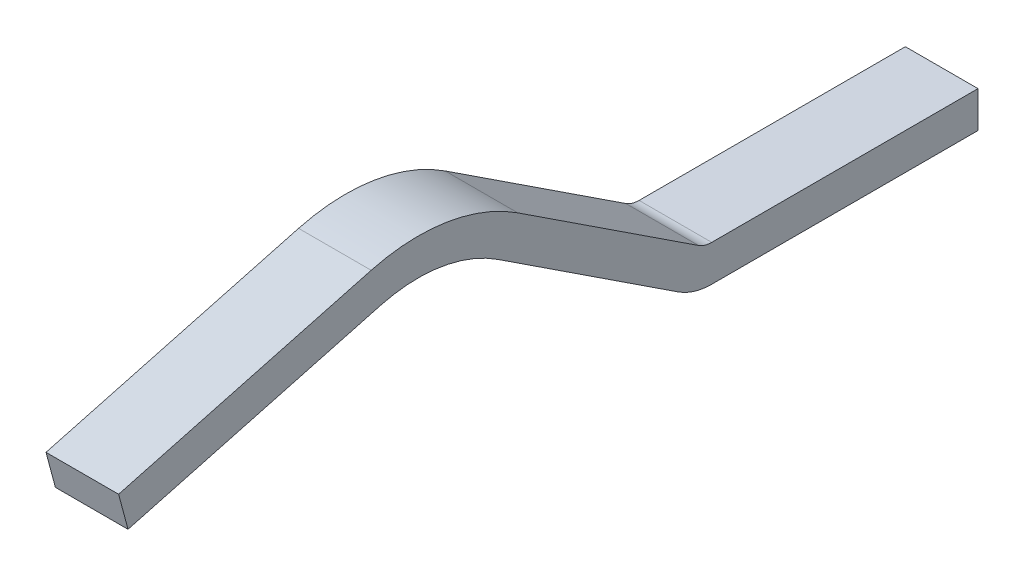
ISO-10303-21;
HEADER;
FILE_DESCRIPTION(('STEP AP214'),'2;1');
FILE_NAME('part.step','',(''),(''),'','','');
FILE_SCHEMA(('AUTOMOTIVE_DESIGN { 1 0 10303 214 1 1 1 1 }'));
ENDSEC;
DATA;
#1=APPLICATION_CONTEXT('core data for automotive mechanical design processes');
#2=APPLICATION_PROTOCOL_DEFINITION('international standard','automotive_design',2000,#1);
#3=PRODUCT_CONTEXT('',#1,'mechanical');
#4=PRODUCT('Part','Part','',(#3));
#5=PRODUCT_RELATED_PRODUCT_CATEGORY('part','',(#4));
#6=PRODUCT_DEFINITION_FORMATION('','',#4);
#7=PRODUCT_DEFINITION_CONTEXT('part definition',#1,'design');
#8=PRODUCT_DEFINITION('design','',#6,#7);
#9=PRODUCT_DEFINITION_SHAPE('','',#8);
#10=(LENGTH_UNIT() NAMED_UNIT(*) SI_UNIT(.MILLI.,.METRE.));
#11=(NAMED_UNIT(*) PLANE_ANGLE_UNIT() SI_UNIT($,.RADIAN.));
#12=(NAMED_UNIT(*) SI_UNIT($,.STERADIAN.) SOLID_ANGLE_UNIT());
#13=UNCERTAINTY_MEASURE_WITH_UNIT(LENGTH_MEASURE(1.E-05),#10,'distance_accuracy_value','');
#14=(GEOMETRIC_REPRESENTATION_CONTEXT(3) GLOBAL_UNCERTAINTY_ASSIGNED_CONTEXT((#13)) GLOBAL_UNIT_ASSIGNED_CONTEXT((#10,
#11,#12)) REPRESENTATION_CONTEXT('',''));
#15=CARTESIAN_POINT('',(0.,0.,0.));
#16=DIRECTION('',(0.,0.,1.));
#17=DIRECTION('',(1.,0.,0.));
#18=AXIS2_PLACEMENT_3D('',#15,#16,#17);
#19=CARTESIAN_POINT('',(-4.55000000000001,5.07100850144757,-1.18999999999999));
#20=DIRECTION('',(-1.,0.,0.));
#21=DIRECTION('',(0.,0.,1.));
#22=AXIS2_PLACEMENT_3D('',#19,#20,#21);
#23=PLANE('',#22);
#24=CARTESIAN_POINT('',(-4.55000000000001,5.07100850144757,-1.18999999999999));
#25=DIRECTION('',(1.,0.,0.));
#26=DIRECTION('',(0.,0.,-1.));
#27=AXIS2_PLACEMENT_3D('',#24,#25,#26);
#28=CIRCLE('',#27,0.1);
#29=CARTESIAN_POINT('',(-4.55000000000001,4.98740012933444,-1.13513981304631));
#30=VERTEX_POINT('',#29);
#31=CARTESIAN_POINT('',(-4.55000000000001,4.97100850144757,-1.18999999999999));
#32=VERTEX_POINT('',#31);
#33=EDGE_CURVE('E11',#30,#32,#28,.T.);
#34=ORIENTED_EDGE('',*,*,#33,.T.);
#35=DIRECTION('',(0.,0.,-1.));
#36=VECTOR('',#35,1.);
#37=CARTESIAN_POINT('',(-4.55000000000001,4.97100850144757,-1.18999999999999));
#38=LINE('',#37,#36);
#39=CARTESIAN_POINT('',(-4.55000000000001,4.97100850144757,-2.28999999999999));
#40=VERTEX_POINT('',#39);
#41=EDGE_CURVE('E24',#32,#40,#38,.T.);
#42=ORIENTED_EDGE('',*,*,#41,.T.);
#43=DIRECTION('',(0.,-1.,0.));
#44=VECTOR('',#43,1.);
#45=CARTESIAN_POINT('',(-4.55000000000001,5.07100850144757,-2.28999999999999));
#46=LINE('',#45,#44);
#47=CARTESIAN_POINT('',(-4.55000000000001,4.82100850144757,-2.28999999999999));
#48=VERTEX_POINT('',#47);
#49=EDGE_CURVE('E197',#40,#48,#46,.T.);
#50=ORIENTED_EDGE('',*,*,#49,.T.);
#51=DIRECTION('',(0.,0.,1.));
#52=VECTOR('',#51,1.);
#53=CARTESIAN_POINT('',(-4.55000000000001,4.82100850144757,-1.18999999999999));
#54=LINE('',#53,#52);
#55=CARTESIAN_POINT('',(-4.55000000000001,4.82100850144757,-1.18999999999999));
#56=VERTEX_POINT('',#55);
#57=EDGE_CURVE('E107',#48,#56,#54,.T.);
#58=ORIENTED_EDGE('',*,*,#57,.T.);
#59=CARTESIAN_POINT('',(-4.55000000000001,5.07100850144757,-1.18999999999999));
#60=DIRECTION('',(-1.,0.,0.));
#61=DIRECTION('',(0.,0.,-1.));
#62=AXIS2_PLACEMENT_3D('',#59,#60,#61);
#63=CIRCLE('',#62,0.25);
#64=CARTESIAN_POINT('',(-4.55000000000001,4.86198757116474,-1.0528495326158));
#65=VERTEX_POINT('',#64);
#66=EDGE_CURVE('E194',#56,#65,#63,.T.);
#67=ORIENTED_EDGE('',*,*,#66,.T.);
#68=DIRECTION('',(0.,0.548601869536769,0.836083721131301));
#69=VECTOR('',#68,1.);
#70=CARTESIAN_POINT('',(-4.55000000000001,4.86198757116474,-1.0528495326158));
#71=LINE('',#70,#69);
#72=CARTESIAN_POINT('',(-4.55000000000001,5.35165023267873,-0.306590719310327));
#73=VERTEX_POINT('',#72);
#74=EDGE_CURVE('E192',#65,#73,#71,.T.);
#75=ORIENTED_EDGE('',*,*,#74,.T.);
#76=CARTESIAN_POINT('',(-4.55000000000001,4.84999999999995,0.0225704024117354));
#77=DIRECTION('',(1.,0.,0.));
#78=DIRECTION('',(0.,0.,-1.));
#79=AXIS2_PLACEMENT_3D('',#76,#77,#78);
#80=CIRCLE('',#79,0.6);
#81=CARTESIAN_POINT('',(-4.55000000000001,5.42955549577339,0.177861829473247));
#82=VERTEX_POINT('',#81);
#83=EDGE_CURVE('E190',#73,#82,#80,.T.);
#84=ORIENTED_EDGE('',*,*,#83,.T.);
#85=DIRECTION('',(0.,-0.258819045102521,0.965925826289068));
#86=VECTOR('',#85,1.);
#87=CARTESIAN_POINT('',(-4.55000000000001,5.42955549577339,0.177861829473248));
#88=LINE('',#87,#86);
#89=CARTESIAN_POINT('',(-4.55000000000001,5.15,1.22117714323463));
#90=VERTEX_POINT('',#89);
#91=EDGE_CURVE('E188',#82,#90,#88,.T.);
#92=ORIENTED_EDGE('',*,*,#91,.T.);
#93=DIRECTION('',(0.,0.965925826289067,0.258819045102525));
#94=VECTOR('',#93,1.);
#95=CARTESIAN_POINT('',(-4.55000000000001,5.15,1.22117714323463));
#96=LINE('',#95,#94);
#97=CARTESIAN_POINT('',(-4.55000000000001,5.29488887394337,1.26000000000001));
#98=VERTEX_POINT('',#97);
#99=EDGE_CURVE('E186',#90,#98,#96,.T.);
#100=ORIENTED_EDGE('',*,*,#99,.T.);
#101=DIRECTION('',(0.,0.258819045102521,-0.965925826289068));
#102=VECTOR('',#101,1.);
#103=CARTESIAN_POINT('',(-4.55000000000001,5.29488887394337,1.26000000000001));
#104=LINE('',#103,#102);
#105=CARTESIAN_POINT('',(-4.55000000000001,5.57444436971675,0.216684686238627));
#106=VERTEX_POINT('',#105);
#107=EDGE_CURVE('E184',#98,#106,#104,.T.);
#108=ORIENTED_EDGE('',*,*,#107,.T.);
#109=CARTESIAN_POINT('',(-4.55000000000001,4.84999999999995,0.0225704024117354));
#110=DIRECTION('',(-1.,0.,0.));
#111=DIRECTION('',(0.,0.,-1.));
#112=AXIS2_PLACEMENT_3D('',#109,#110,#111);
#113=CIRCLE('',#112,0.75);
#114=CARTESIAN_POINT('',(-4.55000000000001,5.47706279084843,-0.388880999740842));
#115=VERTEX_POINT('',#114);
#116=EDGE_CURVE('E182',#106,#115,#113,.T.);
#117=ORIENTED_EDGE('',*,*,#116,.T.);
#118=DIRECTION('',(0.,-0.548601869536769,-0.8360837211313));
#119=VECTOR('',#118,1.);
#120=CARTESIAN_POINT('',(-4.55000000000001,5.47706279084843,-0.388880999740842));
#121=LINE('',#120,#119);
#122=EDGE_CURVE('E180',#115,#30,#121,.T.);
#123=ORIENTED_EDGE('',*,*,#122,.T.);
#124=EDGE_LOOP('',(#34,#42,#50,#58,#67,#75,#84,#92,#100,#108,#117,#123));
#125=FACE_BOUND('',#124,.T.);
#126=ADVANCED_FACE('F17',(#125),#23,.T.);
#127=CARTESIAN_POINT('',(-4.55000000000001,4.97100850144757,-1.18999999999999));
#128=DIRECTION('',(0.,-1.,0.));
#129=DIRECTION('',(0.,0.,-1.));
#130=AXIS2_PLACEMENT_3D('',#127,#128,#129);
#131=PLANE('',#130);
#132=DIRECTION('',(1.,0.,0.));
#133=VECTOR('',#132,1.);
#134=CARTESIAN_POINT('',(-4.55000000000001,4.97100850144757,-2.28999999999999));
#135=LINE('',#134,#133);
#136=CARTESIAN_POINT('',(-4.25000000000001,4.97100850144757,-2.28999999999999));
#137=VERTEX_POINT('',#136);
#138=EDGE_CURVE('E124',#40,#137,#135,.T.);
#139=ORIENTED_EDGE('',*,*,#138,.F.);
#140=ORIENTED_EDGE('',*,*,#41,.F.);
#141=DIRECTION('',(-1.,0.,0.));
#142=VECTOR('',#141,1.);
#143=CARTESIAN_POINT('',(-4.55000000000001,4.97100850144757,-1.18999999999999));
#144=LINE('',#143,#142);
#145=CARTESIAN_POINT('',(-4.25000000000001,4.97100850144757,-1.18999999999999));
#146=VERTEX_POINT('',#145);
#147=EDGE_CURVE('E177',#146,#32,#144,.T.);
#148=ORIENTED_EDGE('',*,*,#147,.F.);
#149=DIRECTION('',(0.,0.,1.));
#150=VECTOR('',#149,1.);
#151=CARTESIAN_POINT('',(-4.25000000000001,4.97100850144757,-1.18999999999999));
#152=LINE('',#151,#150);
#153=EDGE_CURVE('E175',#137,#146,#152,.T.);
#154=ORIENTED_EDGE('',*,*,#153,.F.);
#155=EDGE_LOOP('',(#139,#140,#148,#154));
#156=FACE_BOUND('',#155,.T.);
#157=ADVANCED_FACE('F199',(#156),#131,.F.);
#158=CARTESIAN_POINT('',(-4.55000000000001,5.47706279084843,-0.388880999740842));
#159=DIRECTION('',(0.,-0.8360837211313,0.548601869536769));
#160=DIRECTION('',(0.,-0.548601869536769,-0.8360837211313));
#161=AXIS2_PLACEMENT_3D('',#158,#159,#160);
#162=PLANE('',#161);
#163=DIRECTION('',(1.,0.,0.));
#164=VECTOR('',#163,1.);
#165=CARTESIAN_POINT('',(-4.55000000000001,4.98740012933444,-1.13513981304631));
#166=LINE('',#165,#164);
#167=CARTESIAN_POINT('',(-4.25000000000001,4.98740012933444,-1.13513981304631));
#168=VERTEX_POINT('',#167);
#169=EDGE_CURVE('E173',#30,#168,#166,.T.);
#170=ORIENTED_EDGE('',*,*,#169,.F.);
#171=ORIENTED_EDGE('',*,*,#122,.F.);
#172=DIRECTION('',(-1.,0.,0.));
#173=VECTOR('',#172,1.);
#174=CARTESIAN_POINT('',(-4.55000000000001,5.47706279084843,-0.388880999740842));
#175=LINE('',#174,#173);
#176=CARTESIAN_POINT('',(-4.25000000000001,5.47706279084843,-0.388880999740842));
#177=VERTEX_POINT('',#176);
#178=EDGE_CURVE('E170',#177,#115,#175,.T.);
#179=ORIENTED_EDGE('',*,*,#178,.F.);
#180=DIRECTION('',(0.,0.548601869536769,0.8360837211313));
#181=VECTOR('',#180,1.);
#182=CARTESIAN_POINT('',(-4.25000000000001,5.47706279084843,-0.388880999740842));
#183=LINE('',#182,#181);
#184=EDGE_CURVE('E167',#168,#177,#183,.T.);
#185=ORIENTED_EDGE('',*,*,#184,.F.);
#186=EDGE_LOOP('',(#170,#171,#179,#185));
#187=FACE_BOUND('',#186,.T.);
#188=ADVANCED_FACE('F206',(#187),#162,.F.);
#189=CARTESIAN_POINT('',(-4.55000000000001,4.84999999999995,0.0225704024117354));
#190=DIRECTION('',(1.,0.,0.));
#191=DIRECTION('',(0.,0.,-1.));
#192=AXIS2_PLACEMENT_3D('',#189,#190,#191);
#193=CYLINDRICAL_SURFACE('',#192,0.75);
#194=ORIENTED_EDGE('',*,*,#116,.F.);
#195=DIRECTION('',(1.,0.,0.));
#196=VECTOR('',#195,1.);
#197=CARTESIAN_POINT('',(-4.55000000000001,5.57444436971675,0.216684686238627));
#198=LINE('',#197,#196);
#199=CARTESIAN_POINT('',(-4.25000000000001,5.57444436971675,0.216684686238627));
#200=VERTEX_POINT('',#199);
#201=EDGE_CURVE('E165',#106,#200,#198,.T.);
#202=ORIENTED_EDGE('',*,*,#201,.T.);
#203=CARTESIAN_POINT('',(-4.25000000000001,4.84999999999995,0.0225704024117354));
#204=DIRECTION('',(-1.,0.,0.));
#205=DIRECTION('',(0.,0.,-1.));
#206=AXIS2_PLACEMENT_3D('',#203,#204,#205);
#207=CIRCLE('',#206,0.75);
#208=EDGE_CURVE('E162',#200,#177,#207,.T.);
#209=ORIENTED_EDGE('',*,*,#208,.T.);
#210=ORIENTED_EDGE('',*,*,#178,.T.);
#211=EDGE_LOOP('',(#194,#202,#209,#210));
#212=FACE_BOUND('',#211,.T.);
#213=ADVANCED_FACE('F211',(#212),#193,.T.);
#214=CARTESIAN_POINT('',(-4.55000000000001,5.29488887394337,1.26000000000001));
#215=DIRECTION('',(0.,-0.965925826289068,-0.258819045102522));
#216=DIRECTION('',(0.,0.258819045102522,-0.965925826289068));
#217=AXIS2_PLACEMENT_3D('',#214,#215,#216);
#218=PLANE('',#217);
#219=ORIENTED_EDGE('',*,*,#201,.F.);
#220=ORIENTED_EDGE('',*,*,#107,.F.);
#221=DIRECTION('',(-1.,0.,0.));
#222=VECTOR('',#221,1.);
#223=CARTESIAN_POINT('',(-4.55000000000001,5.29488887394337,1.26000000000001));
#224=LINE('',#223,#222);
#225=CARTESIAN_POINT('',(-4.25000000000001,5.29488887394337,1.26000000000001));
#226=VERTEX_POINT('',#225);
#227=EDGE_CURVE('E159',#226,#98,#224,.T.);
#228=ORIENTED_EDGE('',*,*,#227,.F.);
#229=DIRECTION('',(0.,-0.258819045102522,0.965925826289068));
#230=VECTOR('',#229,1.);
#231=CARTESIAN_POINT('',(-4.25000000000001,5.29488887394337,1.26000000000001));
#232=LINE('',#231,#230);
#233=EDGE_CURVE('E156',#200,#226,#232,.T.);
#234=ORIENTED_EDGE('',*,*,#233,.F.);
#235=EDGE_LOOP('',(#219,#220,#228,#234));
#236=FACE_BOUND('',#235,.T.);
#237=ADVANCED_FACE('F215',(#236),#218,.F.);
#238=CARTESIAN_POINT('',(-4.55000000000001,5.15,1.22117714323463));
#239=DIRECTION('',(0.,0.258819045102524,-0.965925826289067));
#240=DIRECTION('',(0.,0.965925826289067,0.258819045102524));
#241=AXIS2_PLACEMENT_3D('',#238,#239,#240);
#242=PLANE('',#241);
#243=ORIENTED_EDGE('',*,*,#227,.T.);
#244=ORIENTED_EDGE('',*,*,#99,.F.);
#245=DIRECTION('',(-1.,0.,0.));
#246=VECTOR('',#245,1.);
#247=CARTESIAN_POINT('',(-4.55000000000001,5.15,1.22117714323463));
#248=LINE('',#247,#246);
#249=CARTESIAN_POINT('',(-4.25000000000001,5.15,1.22117714323463));
#250=VERTEX_POINT('',#249);
#251=EDGE_CURVE('E153',#250,#90,#248,.T.);
#252=ORIENTED_EDGE('',*,*,#251,.F.);
#253=DIRECTION('',(0.,-0.965925826289067,-0.258819045102524));
#254=VECTOR('',#253,1.);
#255=CARTESIAN_POINT('',(-4.25000000000001,5.15,1.22117714323463));
#256=LINE('',#255,#254);
#257=EDGE_CURVE('E150',#226,#250,#256,.T.);
#258=ORIENTED_EDGE('',*,*,#257,.F.);
#259=EDGE_LOOP('',(#243,#244,#252,#258));
#260=FACE_BOUND('',#259,.T.);
#261=ADVANCED_FACE('F219',(#260),#242,.F.);
#262=CARTESIAN_POINT('',(-4.55000000000001,5.42955549577339,0.177861829473248));
#263=DIRECTION('',(0.,0.965925826289068,0.258819045102521));
#264=DIRECTION('',(0.,-0.258819045102521,0.965925826289068));
#265=AXIS2_PLACEMENT_3D('',#262,#263,#264);
#266=PLANE('',#265);
#267=ORIENTED_EDGE('',*,*,#251,.T.);
#268=ORIENTED_EDGE('',*,*,#91,.F.);
#269=DIRECTION('',(-1.,0.,0.));
#270=VECTOR('',#269,1.);
#271=CARTESIAN_POINT('',(-4.55000000000001,5.42955549577339,0.177861829473248));
#272=LINE('',#271,#270);
#273=CARTESIAN_POINT('',(-4.25000000000001,5.42955549577339,0.177861829473247));
#274=VERTEX_POINT('',#273);
#275=EDGE_CURVE('E147',#274,#82,#272,.T.);
#276=ORIENTED_EDGE('',*,*,#275,.F.);
#277=DIRECTION('',(0.,0.258819045102521,-0.965925826289068));
#278=VECTOR('',#277,1.);
#279=CARTESIAN_POINT('',(-4.25000000000001,5.42955549577339,0.177861829473248));
#280=LINE('',#279,#278);
#281=EDGE_CURVE('E144',#250,#274,#280,.T.);
#282=ORIENTED_EDGE('',*,*,#281,.F.);
#283=EDGE_LOOP('',(#267,#268,#276,#282));
#284=FACE_BOUND('',#283,.T.);
#285=ADVANCED_FACE('F223',(#284),#266,.F.);
#286=CARTESIAN_POINT('',(-4.55000000000001,4.84999999999995,0.0225704024117354));
#287=DIRECTION('',(1.,0.,0.));
#288=DIRECTION('',(0.,0.,-1.));
#289=AXIS2_PLACEMENT_3D('',#286,#287,#288);
#290=CYLINDRICAL_SURFACE('',#289,0.6);
#291=ORIENTED_EDGE('',*,*,#275,.T.);
#292=ORIENTED_EDGE('',*,*,#83,.F.);
#293=DIRECTION('',(-1.,0.,0.));
#294=VECTOR('',#293,1.);
#295=CARTESIAN_POINT('',(-4.55000000000001,5.35165023267873,-0.306590719310325));
#296=LINE('',#295,#294);
#297=CARTESIAN_POINT('',(-4.25000000000001,5.35165023267873,-0.306590719310327));
#298=VERTEX_POINT('',#297);
#299=EDGE_CURVE('E141',#298,#73,#296,.T.);
#300=ORIENTED_EDGE('',*,*,#299,.F.);
#301=CARTESIAN_POINT('',(-4.25000000000001,4.84999999999995,0.0225704024117354));
#302=DIRECTION('',(-1.,0.,0.));
#303=DIRECTION('',(0.,0.,-1.));
#304=AXIS2_PLACEMENT_3D('',#301,#302,#303);
#305=CIRCLE('',#304,0.6);
#306=EDGE_CURVE('E139',#274,#298,#305,.T.);
#307=ORIENTED_EDGE('',*,*,#306,.F.);
#308=EDGE_LOOP('',(#291,#292,#300,#307));
#309=FACE_BOUND('',#308,.T.);
#310=ADVANCED_FACE('F227',(#309),#290,.F.);
#311=CARTESIAN_POINT('',(-4.55000000000001,4.86198757116474,-1.0528495326158));
#312=DIRECTION('',(0.,0.8360837211313,-0.548601869536769));
#313=DIRECTION('',(0.,0.548601869536769,0.8360837211313));
#314=AXIS2_PLACEMENT_3D('',#311,#312,#313);
#315=PLANE('',#314);
#316=ORIENTED_EDGE('',*,*,#299,.T.);
#317=ORIENTED_EDGE('',*,*,#74,.F.);
#318=DIRECTION('',(-1.,0.,0.));
#319=VECTOR('',#318,1.);
#320=CARTESIAN_POINT('',(-4.55000000000001,4.86198757116474,-1.0528495326158));
#321=LINE('',#320,#319);
#322=CARTESIAN_POINT('',(-4.25000000000001,4.86198757116474,-1.0528495326158));
#323=VERTEX_POINT('',#322);
#324=EDGE_CURVE('E136',#323,#65,#321,.T.);
#325=ORIENTED_EDGE('',*,*,#324,.F.);
#326=DIRECTION('',(0.,-0.548601869536769,-0.8360837211313));
#327=VECTOR('',#326,1.);
#328=CARTESIAN_POINT('',(-4.25000000000001,4.86198757116474,-1.0528495326158));
#329=LINE('',#328,#327);
#330=EDGE_CURVE('E134',#298,#323,#329,.T.);
#331=ORIENTED_EDGE('',*,*,#330,.F.);
#332=EDGE_LOOP('',(#316,#317,#325,#331));
#333=FACE_BOUND('',#332,.T.);
#334=ADVANCED_FACE('F232',(#333),#315,.F.);
#335=CARTESIAN_POINT('',(-4.55000000000001,5.07100850144757,-1.18999999999999));
#336=DIRECTION('',(1.,0.,0.));
#337=DIRECTION('',(0.,0.,-1.));
#338=AXIS2_PLACEMENT_3D('',#335,#336,#337);
#339=CYLINDRICAL_SURFACE('',#338,0.25);
#340=ORIENTED_EDGE('',*,*,#66,.F.);
#341=DIRECTION('',(1.,0.,0.));
#342=VECTOR('',#341,1.);
#343=CARTESIAN_POINT('',(-4.55000000000001,4.82100850144757,-1.18999999999999));
#344=LINE('',#343,#342);
#345=CARTESIAN_POINT('',(-4.25000000000001,4.82100850144757,-1.18999999999999));
#346=VERTEX_POINT('',#345);
#347=EDGE_CURVE('E132',#56,#346,#344,.T.);
#348=ORIENTED_EDGE('',*,*,#347,.T.);
#349=CARTESIAN_POINT('',(-4.25000000000001,5.07100850144757,-1.18999999999999));
#350=DIRECTION('',(-1.,0.,0.));
#351=DIRECTION('',(0.,0.,-1.));
#352=AXIS2_PLACEMENT_3D('',#349,#350,#351);
#353=CIRCLE('',#352,0.25);
#354=EDGE_CURVE('E111',#346,#323,#353,.T.);
#355=ORIENTED_EDGE('',*,*,#354,.T.);
#356=ORIENTED_EDGE('',*,*,#324,.T.);
#357=EDGE_LOOP('',(#340,#348,#355,#356));
#358=FACE_BOUND('',#357,.T.);
#359=ADVANCED_FACE('F235',(#358),#339,.T.);
#360=CARTESIAN_POINT('',(-4.55000000000001,4.82100850144757,-2.28999999999999));
#361=DIRECTION('',(0.,1.,0.));
#362=DIRECTION('',(0.,0.,1.));
#363=AXIS2_PLACEMENT_3D('',#360,#361,#362);
#364=PLANE('',#363);
#365=ORIENTED_EDGE('',*,*,#347,.F.);
#366=ORIENTED_EDGE('',*,*,#57,.F.);
#367=DIRECTION('',(-1.,0.,0.));
#368=VECTOR('',#367,1.);
#369=CARTESIAN_POINT('',(-4.55000000000001,4.82100850144757,-2.28999999999999));
#370=LINE('',#369,#368);
#371=CARTESIAN_POINT('',(-4.25000000000001,4.82100850144757,-2.28999999999999));
#372=VERTEX_POINT('',#371);
#373=EDGE_CURVE('E102',#372,#48,#370,.T.);
#374=ORIENTED_EDGE('',*,*,#373,.F.);
#375=DIRECTION('',(0.,0.,-1.));
#376=VECTOR('',#375,1.);
#377=CARTESIAN_POINT('',(-4.25000000000001,4.82100850144757,-2.28999999999999));
#378=LINE('',#377,#376);
#379=EDGE_CURVE('E106',#346,#372,#378,.T.);
#380=ORIENTED_EDGE('',*,*,#379,.F.);
#381=EDGE_LOOP('',(#365,#366,#374,#380));
#382=FACE_BOUND('',#381,.T.);
#383=ADVANCED_FACE('F105',(#382),#364,.F.);
#384=CARTESIAN_POINT('',(-4.55000000000001,4.97100850144757,-2.28999999999999));
#385=DIRECTION('',(0.,0.,1.));
#386=DIRECTION('',(1.,0.,0.));
#387=AXIS2_PLACEMENT_3D('',#384,#385,#386);
#388=PLANE('',#387);
#389=ORIENTED_EDGE('',*,*,#373,.T.);
#390=ORIENTED_EDGE('',*,*,#49,.F.);
#391=ORIENTED_EDGE('',*,*,#138,.T.);
#392=DIRECTION('',(0.,1.,0.));
#393=VECTOR('',#392,1.);
#394=CARTESIAN_POINT('',(-4.25000000000001,4.97100850144757,-2.28999999999999));
#395=LINE('',#394,#393);
#396=EDGE_CURVE('E118',#372,#137,#395,.T.);
#397=ORIENTED_EDGE('',*,*,#396,.F.);
#398=EDGE_LOOP('',(#389,#390,#391,#397));
#399=FACE_BOUND('',#398,.T.);
#400=ADVANCED_FACE('F122',(#399),#388,.F.);
#401=CARTESIAN_POINT('',(-4.25000000000001,5.07100850144757,-1.18999999999999));
#402=DIRECTION('',(-1.,0.,0.));
#403=DIRECTION('',(0.,0.,1.));
#404=AXIS2_PLACEMENT_3D('',#401,#402,#403);
#405=PLANE('',#404);
#406=ORIENTED_EDGE('',*,*,#153,.T.);
#407=CARTESIAN_POINT('',(-4.25000000000001,5.07100850144757,-1.18999999999999));
#408=DIRECTION('',(1.,0.,0.));
#409=DIRECTION('',(0.,0.,-1.));
#410=AXIS2_PLACEMENT_3D('',#407,#408,#409);
#411=CIRCLE('',#410,0.1);
#412=EDGE_CURVE('E126',#168,#146,#411,.T.);
#413=ORIENTED_EDGE('',*,*,#412,.F.);
#414=ORIENTED_EDGE('',*,*,#184,.T.);
#415=ORIENTED_EDGE('',*,*,#208,.F.);
#416=ORIENTED_EDGE('',*,*,#233,.T.);
#417=ORIENTED_EDGE('',*,*,#257,.T.);
#418=ORIENTED_EDGE('',*,*,#281,.T.);
#419=ORIENTED_EDGE('',*,*,#306,.T.);
#420=ORIENTED_EDGE('',*,*,#330,.T.);
#421=ORIENTED_EDGE('',*,*,#354,.F.);
#422=ORIENTED_EDGE('',*,*,#379,.T.);
#423=ORIENTED_EDGE('',*,*,#396,.T.);
#424=EDGE_LOOP('',(#406,#413,#414,#415,#416,#417,#418,#419,#420,#421,#422,#423));
#425=FACE_BOUND('',#424,.T.);
#426=ADVANCED_FACE('F117',(#425),#405,.F.);
#427=CARTESIAN_POINT('',(-4.55000000000001,5.07100850144757,-1.18999999999999));
#428=DIRECTION('',(1.,0.,0.));
#429=DIRECTION('',(0.,0.,-1.));
#430=AXIS2_PLACEMENT_3D('',#427,#428,#429);
#431=CYLINDRICAL_SURFACE('',#430,0.1);
#432=ORIENTED_EDGE('',*,*,#147,.T.);
#433=ORIENTED_EDGE('',*,*,#33,.F.);
#434=ORIENTED_EDGE('',*,*,#169,.T.);
#435=ORIENTED_EDGE('',*,*,#412,.T.);
#436=EDGE_LOOP('',(#432,#433,#434,#435));
#437=FACE_BOUND('',#436,.T.);
#438=ADVANCED_FACE('F201',(#437),#431,.F.);
#439=CLOSED_SHELL('',(#126,#157,#188,#213,#237,#261,#285,#310,#334,#359,#383,#400,#426,#438));
#440=MANIFOLD_SOLID_BREP('B1',#439);
#441=ADVANCED_BREP_SHAPE_REPRESENTATION('',(#18,#440),#14);
#442=SHAPE_DEFINITION_REPRESENTATION(#9,#441);
ENDSEC;
END-ISO-10303-21;
